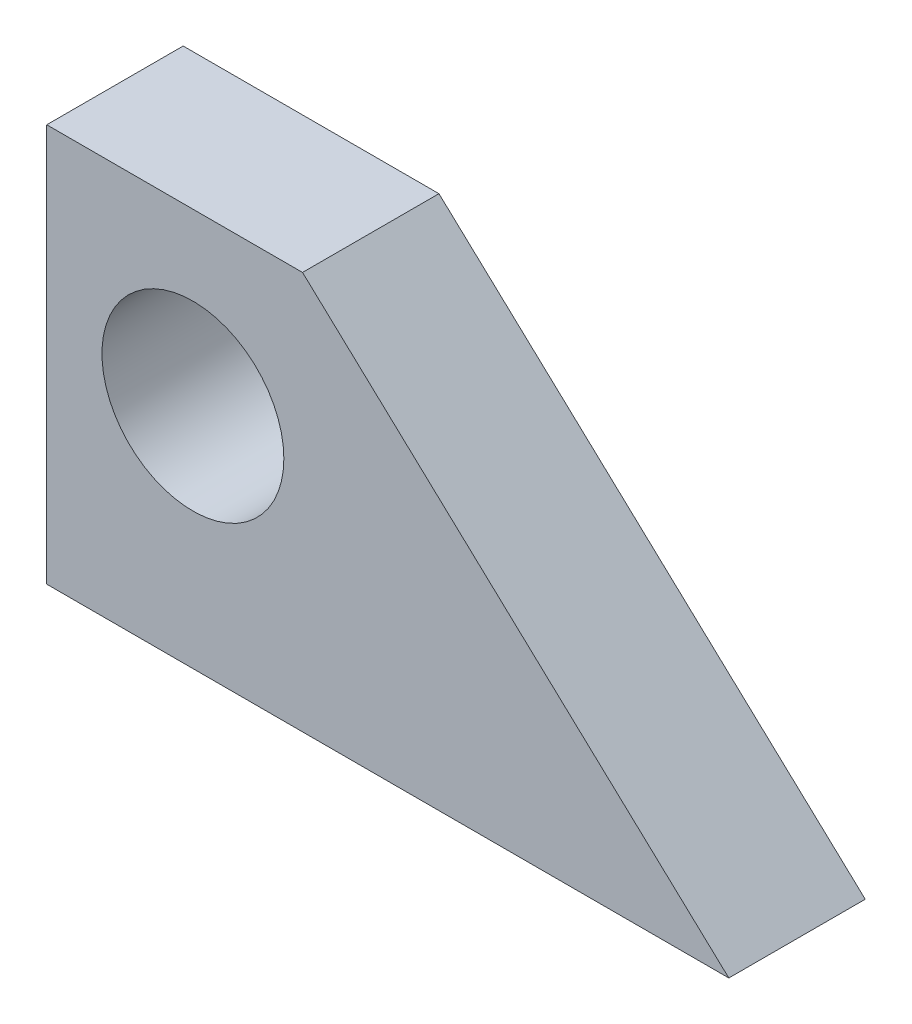
ISO-10303-21;
HEADER;
FILE_DESCRIPTION(('STEP AP214'),'2;1');
FILE_NAME('part.step','',(''),(''),'','','');
FILE_SCHEMA(('AUTOMOTIVE_DESIGN { 1 0 10303 214 1 1 1 1 }'));
ENDSEC;
DATA;
#1=APPLICATION_CONTEXT('core data for automotive mechanical design processes');
#2=APPLICATION_PROTOCOL_DEFINITION('international standard','automotive_design',2000,#1);
#3=PRODUCT_CONTEXT('',#1,'mechanical');
#4=PRODUCT('Part','Part','',(#3));
#5=PRODUCT_RELATED_PRODUCT_CATEGORY('part','',(#4));
#6=PRODUCT_DEFINITION_FORMATION('','',#4);
#7=PRODUCT_DEFINITION_CONTEXT('part definition',#1,'design');
#8=PRODUCT_DEFINITION('design','',#6,#7);
#9=PRODUCT_DEFINITION_SHAPE('','',#8);
#10=(LENGTH_UNIT() NAMED_UNIT(*) SI_UNIT(.MILLI.,.METRE.));
#11=(NAMED_UNIT(*) PLANE_ANGLE_UNIT() SI_UNIT($,.RADIAN.));
#12=(NAMED_UNIT(*) SI_UNIT($,.STERADIAN.) SOLID_ANGLE_UNIT());
#13=UNCERTAINTY_MEASURE_WITH_UNIT(LENGTH_MEASURE(1.E-05),#10,'distance_accuracy_value','');
#14=(GEOMETRIC_REPRESENTATION_CONTEXT(3) GLOBAL_UNCERTAINTY_ASSIGNED_CONTEXT((#13)) GLOBAL_UNIT_ASSIGNED_CONTEXT((#10,
#11,#12)) REPRESENTATION_CONTEXT('',''));
#15=CARTESIAN_POINT('',(0.,0.,0.));
#16=DIRECTION('',(0.,0.,1.));
#17=DIRECTION('',(1.,0.,0.));
#18=AXIS2_PLACEMENT_3D('',#15,#16,#17);
#19=CARTESIAN_POINT('',(-6.42857142857143,7.5,-3.));
#20=DIRECTION('',(-1.,0.,0.));
#21=DIRECTION('',(0.,-1.,0.));
#22=AXIS2_PLACEMENT_3D('',#19,#20,#21);
#23=PLANE('',#22);
#24=DIRECTION('',(0.,0.,1.));
#25=VECTOR('',#24,1.);
#26=CARTESIAN_POINT('',(-6.42857142857143,-10.,-3.));
#27=LINE('',#26,#25);
#28=CARTESIAN_POINT('',(-6.42857142857143,-10.,-3.));
#29=VERTEX_POINT('',#28);
#30=CARTESIAN_POINT('',(-6.42857142857143,-10.,3.));
#31=VERTEX_POINT('',#30);
#32=EDGE_CURVE('E11',#29,#31,#27,.T.);
#33=ORIENTED_EDGE('',*,*,#32,.T.);
#34=DIRECTION('',(0.,-1.,0.));
#35=VECTOR('',#34,1.);
#36=CARTESIAN_POINT('',(-6.42857142857143,7.5,3.));
#37=LINE('',#36,#35);
#38=CARTESIAN_POINT('',(-6.42857142857143,7.5,3.));
#39=VERTEX_POINT('',#38);
#40=EDGE_CURVE('E90',#39,#31,#37,.T.);
#41=ORIENTED_EDGE('',*,*,#40,.F.);
#42=DIRECTION('',(0.,0.,1.));
#43=VECTOR('',#42,1.);
#44=CARTESIAN_POINT('',(-6.42857142857143,7.5,-3.));
#45=LINE('',#44,#43);
#46=CARTESIAN_POINT('',(-6.42857142857143,7.5,-3.));
#47=VERTEX_POINT('',#46);
#48=EDGE_CURVE('E44',#47,#39,#45,.T.);
#49=ORIENTED_EDGE('',*,*,#48,.F.);
#50=DIRECTION('',(0.,-1.,0.));
#51=VECTOR('',#50,1.);
#52=CARTESIAN_POINT('',(-6.42857142857143,7.5,-3.));
#53=LINE('',#52,#51);
#54=EDGE_CURVE('E82',#47,#29,#53,.T.);
#55=ORIENTED_EDGE('',*,*,#54,.T.);
#56=EDGE_LOOP('',(#33,#41,#49,#55));
#57=FACE_BOUND('',#56,.T.);
#58=ADVANCED_FACE('F35',(#57),#23,.T.);
#59=CARTESIAN_POINT('',(-6.42857142857143,7.5,-3.));
#60=DIRECTION('',(0.,1.,0.));
#61=DIRECTION('',(-1.,0.,0.));
#62=AXIS2_PLACEMENT_3D('',#59,#60,#61);
#63=PLANE('',#62);
#64=ORIENTED_EDGE('',*,*,#48,.T.);
#65=DIRECTION('',(-1.,0.,0.));
#66=VECTOR('',#65,1.);
#67=CARTESIAN_POINT('',(-6.42857142857143,7.5,3.));
#68=LINE('',#67,#66);
#69=CARTESIAN_POINT('',(4.82142857142857,7.5,3.));
#70=VERTEX_POINT('',#69);
#71=EDGE_CURVE('E94',#70,#39,#68,.T.);
#72=ORIENTED_EDGE('',*,*,#71,.F.);
#73=DIRECTION('',(0.,0.,1.));
#74=VECTOR('',#73,1.);
#75=CARTESIAN_POINT('',(4.82142857142857,7.5,-3.));
#76=LINE('',#75,#74);
#77=CARTESIAN_POINT('',(4.82142857142857,7.5,-3.));
#78=VERTEX_POINT('',#77);
#79=EDGE_CURVE('E81',#78,#70,#76,.T.);
#80=ORIENTED_EDGE('',*,*,#79,.F.);
#81=DIRECTION('',(-1.,0.,0.));
#82=VECTOR('',#81,1.);
#83=CARTESIAN_POINT('',(-6.42857142857143,7.5,-3.));
#84=LINE('',#83,#82);
#85=EDGE_CURVE('E103',#78,#47,#84,.T.);
#86=ORIENTED_EDGE('',*,*,#85,.T.);
#87=EDGE_LOOP('',(#64,#72,#80,#86));
#88=FACE_BOUND('',#87,.T.);
#89=ADVANCED_FACE('F107',(#88),#63,.T.);
#90=CARTESIAN_POINT('',(23.5714285714286,-10.,-3.));
#91=DIRECTION('',(0.682318250360011,0.731055268242869,0.));
#92=DIRECTION('',(-0.731055268242869,0.682318250360011,0.));
#93=AXIS2_PLACEMENT_3D('',#90,#91,#92);
#94=PLANE('',#93);
#95=ORIENTED_EDGE('',*,*,#79,.T.);
#96=DIRECTION('',(-0.731055268242869,0.682318250360011,0.));
#97=VECTOR('',#96,1.);
#98=CARTESIAN_POINT('',(23.5714285714286,-10.,3.));
#99=LINE('',#98,#97);
#100=CARTESIAN_POINT('',(23.5714285714286,-10.,3.));
#101=VERTEX_POINT('',#100);
#102=EDGE_CURVE('E88',#101,#70,#99,.T.);
#103=ORIENTED_EDGE('',*,*,#102,.F.);
#104=DIRECTION('',(0.,0.,1.));
#105=VECTOR('',#104,1.);
#106=CARTESIAN_POINT('',(23.5714285714286,-10.,-3.));
#107=LINE('',#106,#105);
#108=CARTESIAN_POINT('',(23.5714285714286,-10.,-3.));
#109=VERTEX_POINT('',#108);
#110=EDGE_CURVE('E39',#109,#101,#107,.T.);
#111=ORIENTED_EDGE('',*,*,#110,.F.);
#112=DIRECTION('',(-0.731055268242869,0.682318250360011,0.));
#113=VECTOR('',#112,1.);
#114=CARTESIAN_POINT('',(23.5714285714286,-10.,-3.));
#115=LINE('',#114,#113);
#116=EDGE_CURVE('E101',#109,#78,#115,.T.);
#117=ORIENTED_EDGE('',*,*,#116,.T.);
#118=EDGE_LOOP('',(#95,#103,#111,#117));
#119=FACE_BOUND('',#118,.T.);
#120=ADVANCED_FACE('F93',(#119),#94,.T.);
#121=CARTESIAN_POINT('',(8.57142857142857,-10.,-3.));
#122=DIRECTION('',(0.,-1.,0.));
#123=DIRECTION('',(1.,0.,0.));
#124=AXIS2_PLACEMENT_3D('',#121,#122,#123);
#125=PLANE('',#124);
#126=ORIENTED_EDGE('',*,*,#110,.T.);
#127=DIRECTION('',(1.,0.,0.));
#128=VECTOR('',#127,1.);
#129=CARTESIAN_POINT('',(-6.42857142857143,-10.,3.));
#130=LINE('',#129,#128);
#131=EDGE_CURVE('E75',#31,#101,#130,.T.);
#132=ORIENTED_EDGE('',*,*,#131,.F.);
#133=ORIENTED_EDGE('',*,*,#32,.F.);
#134=DIRECTION('',(1.,0.,0.));
#135=VECTOR('',#134,1.);
#136=CARTESIAN_POINT('',(-6.42857142857143,-10.,-3.));
#137=LINE('',#136,#135);
#138=EDGE_CURVE('E76',#29,#109,#137,.T.);
#139=ORIENTED_EDGE('',*,*,#138,.T.);
#140=EDGE_LOOP('',(#126,#132,#133,#139));
#141=FACE_BOUND('',#140,.T.);
#142=ADVANCED_FACE('F37',(#141),#125,.T.);
#143=CARTESIAN_POINT('',(0.,0.,-3.));
#144=DIRECTION('',(0.,0.,-1.));
#145=DIRECTION('',(-1.,0.,0.));
#146=AXIS2_PLACEMENT_3D('',#143,#144,#145);
#147=PLANE('',#146);
#148=CARTESIAN_POINT('',(0.,0.,-3.));
#149=DIRECTION('',(0.,0.,-1.));
#150=DIRECTION('',(-1.,0.,0.));
#151=AXIS2_PLACEMENT_3D('',#148,#149,#150);
#152=CIRCLE('',#151,4.);
#153=CARTESIAN_POINT('',(-4.,0.,-3.));
#154=VERTEX_POINT('',#153);
#155=EDGE_CURVE('E91',#154,#154,#152,.T.);
#156=ORIENTED_EDGE('',*,*,#155,.F.);
#157=EDGE_LOOP('',(#156));
#158=FACE_BOUND('',#157,.T.);
#159=ORIENTED_EDGE('',*,*,#138,.F.);
#160=ORIENTED_EDGE('',*,*,#54,.F.);
#161=ORIENTED_EDGE('',*,*,#85,.F.);
#162=ORIENTED_EDGE('',*,*,#116,.F.);
#163=EDGE_LOOP('',(#159,#160,#161,#162));
#164=FACE_BOUND('',#163,.T.);
#165=ADVANCED_FACE('F111',(#158,#164),#147,.T.);
#166=CARTESIAN_POINT('',(0.,0.,3.));
#167=DIRECTION('',(0.,0.,-1.));
#168=DIRECTION('',(-1.,0.,0.));
#169=AXIS2_PLACEMENT_3D('',#166,#167,#168);
#170=PLANE('',#169);
#171=CARTESIAN_POINT('',(0.,0.,3.));
#172=DIRECTION('',(0.,0.,1.));
#173=DIRECTION('',(1.,0.,0.));
#174=AXIS2_PLACEMENT_3D('',#171,#172,#173);
#175=CIRCLE('',#174,4.);
#176=CARTESIAN_POINT('',(4.,0.,3.));
#177=VERTEX_POINT('',#176);
#178=EDGE_CURVE('E166',#177,#177,#175,.T.);
#179=ORIENTED_EDGE('',*,*,#178,.F.);
#180=EDGE_LOOP('',(#179));
#181=FACE_BOUND('',#180,.T.);
#182=ORIENTED_EDGE('',*,*,#131,.T.);
#183=ORIENTED_EDGE('',*,*,#102,.T.);
#184=ORIENTED_EDGE('',*,*,#71,.T.);
#185=ORIENTED_EDGE('',*,*,#40,.T.);
#186=EDGE_LOOP('',(#182,#183,#184,#185));
#187=FACE_BOUND('',#186,.T.);
#188=ADVANCED_FACE('F86',(#181,#187),#170,.F.);
#189=CARTESIAN_POINT('',(0.,0.,-7.));
#190=DIRECTION('',(0.,0.,1.));
#191=DIRECTION('',(1.,0.,0.));
#192=AXIS2_PLACEMENT_3D('',#189,#190,#191);
#193=CYLINDRICAL_SURFACE('',#192,4.);
#194=ORIENTED_EDGE('',*,*,#155,.T.);
#195=EDGE_LOOP('',(#194));
#196=FACE_BOUND('',#195,.T.);
#197=ORIENTED_EDGE('',*,*,#178,.T.);
#198=EDGE_LOOP('',(#197));
#199=FACE_BOUND('',#198,.T.);
#200=ADVANCED_FACE('F119',(#196,#199),#193,.F.);
#201=CLOSED_SHELL('',(#58,#89,#120,#142,#165,#188,#200));
#202=MANIFOLD_SOLID_BREP('B2',#201);
#203=ADVANCED_BREP_SHAPE_REPRESENTATION('',(#18,#202),#14);
#204=SHAPE_DEFINITION_REPRESENTATION(#9,#203);
ENDSEC;
END-ISO-10303-21;
